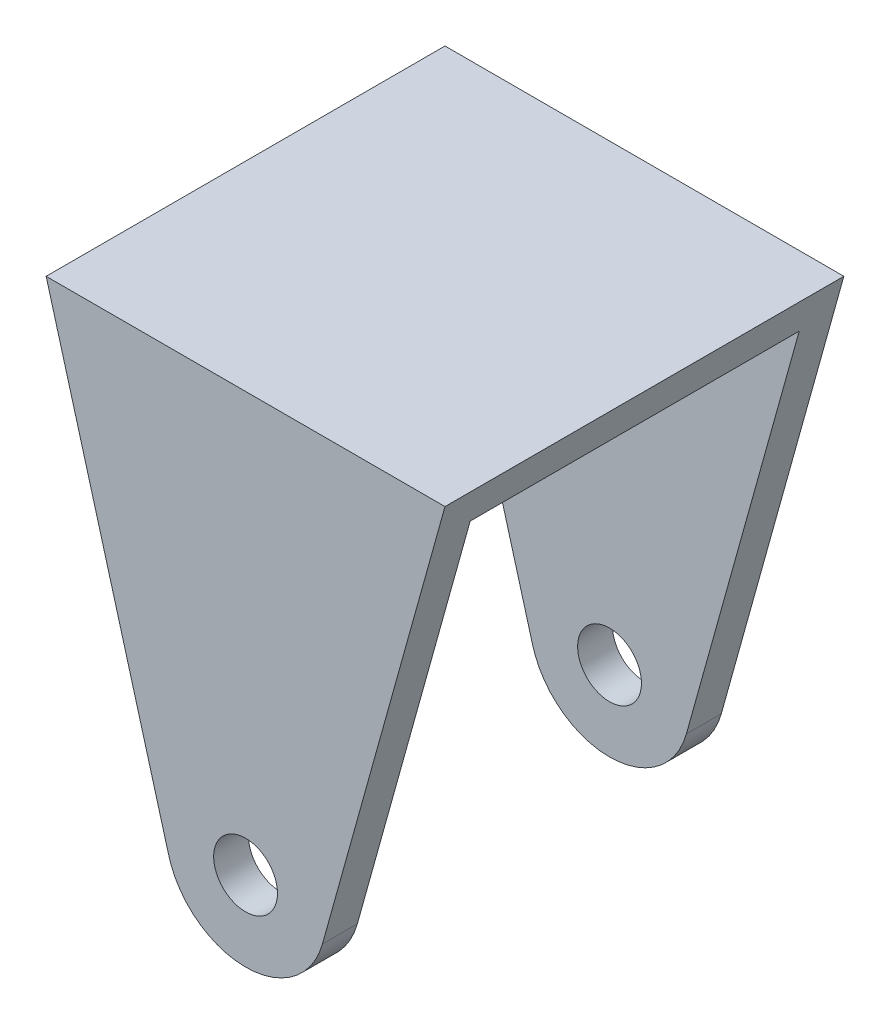
ISO-10303-21;
HEADER;
FILE_DESCRIPTION(('STEP AP214'),'2;1');
FILE_NAME('part.step','',(''),(''),'','','');
FILE_SCHEMA(('AUTOMOTIVE_DESIGN { 1 0 10303 214 1 1 1 1 }'));
ENDSEC;
DATA;
#1=APPLICATION_CONTEXT('core data for automotive mechanical design processes');
#2=APPLICATION_PROTOCOL_DEFINITION('international standard','automotive_design',2000,#1);
#3=PRODUCT_CONTEXT('',#1,'mechanical');
#4=PRODUCT('Part','Part','',(#3));
#5=PRODUCT_RELATED_PRODUCT_CATEGORY('part','',(#4));
#6=PRODUCT_DEFINITION_FORMATION('','',#4);
#7=PRODUCT_DEFINITION_CONTEXT('part definition',#1,'design');
#8=PRODUCT_DEFINITION('design','',#6,#7);
#9=PRODUCT_DEFINITION_SHAPE('','',#8);
#10=(LENGTH_UNIT() NAMED_UNIT(*) SI_UNIT(.MILLI.,.METRE.));
#11=(NAMED_UNIT(*) PLANE_ANGLE_UNIT() SI_UNIT($,.RADIAN.));
#12=(NAMED_UNIT(*) SI_UNIT($,.STERADIAN.) SOLID_ANGLE_UNIT());
#13=UNCERTAINTY_MEASURE_WITH_UNIT(LENGTH_MEASURE(1.E-05),#10,'distance_accuracy_value','');
#14=(GEOMETRIC_REPRESENTATION_CONTEXT(3) GLOBAL_UNCERTAINTY_ASSIGNED_CONTEXT((#13)) GLOBAL_UNIT_ASSIGNED_CONTEXT((#10,
#11,#12)) REPRESENTATION_CONTEXT('',''));
#15=CARTESIAN_POINT('',(0.,0.,0.));
#16=DIRECTION('',(0.,0.,1.));
#17=DIRECTION('',(1.,0.,0.));
#18=AXIS2_PLACEMENT_3D('',#15,#16,#17);
#19=CARTESIAN_POINT('',(0.,0.,35.));
#20=DIRECTION('',(0.,0.,-1.));
#21=DIRECTION('',(-1.,0.,0.));
#22=AXIS2_PLACEMENT_3D('',#19,#20,#21);
#23=CYLINDRICAL_SURFACE('',#22,8.);
#24=DIRECTION('',(0.,0.,-1.));
#25=VECTOR('',#24,1.);
#26=CARTESIAN_POINT('',(7.70677187386858,-2.14608184469933,35.));
#27=LINE('',#26,#25);
#28=CARTESIAN_POINT('',(7.70677187386858,-2.14608184469933,-1.5));
#29=VERTEX_POINT('',#28);
#30=CARTESIAN_POINT('',(7.70677187386858,-2.14608184469933,-5.));
#31=VERTEX_POINT('',#30);
#32=EDGE_CURVE('E187',#29,#31,#27,.T.);
#33=ORIENTED_EDGE('',*,*,#32,.F.);
#34=CARTESIAN_POINT('',(0.,0.,-1.5));
#35=DIRECTION('',(0.,0.,-1.));
#36=DIRECTION('',(-1.,0.,0.));
#37=AXIS2_PLACEMENT_3D('',#34,#35,#36);
#38=CIRCLE('',#37,8.);
#39=CARTESIAN_POINT('',(-7.74121405488212,-2.01831735772539,-1.5));
#40=VERTEX_POINT('',#39);
#41=EDGE_CURVE('E64',#29,#40,#38,.T.);
#42=ORIENTED_EDGE('',*,*,#41,.T.);
#43=DIRECTION('',(0.,0.,-1.));
#44=VECTOR('',#43,1.);
#45=CARTESIAN_POINT('',(-7.74121405488212,-2.01831735772539,35.));
#46=LINE('',#45,#44);
#47=CARTESIAN_POINT('',(-7.74121405488212,-2.01831735772539,-5.));
#48=VERTEX_POINT('',#47);
#49=EDGE_CURVE('E146',#40,#48,#46,.T.);
#50=ORIENTED_EDGE('',*,*,#49,.T.);
#51=CARTESIAN_POINT('',(0.,0.,-5.));
#52=DIRECTION('',(0.,0.,1.));
#53=DIRECTION('',(1.,0.,0.));
#54=AXIS2_PLACEMENT_3D('',#51,#52,#53);
#55=CIRCLE('',#54,8.);
#56=EDGE_CURVE('E172',#48,#31,#55,.T.);
#57=ORIENTED_EDGE('',*,*,#56,.T.);
#58=EDGE_LOOP('',(#33,#42,#50,#57));
#59=FACE_BOUND('',#58,.T.);
#60=ADVANCED_FACE('F47',(#59),#23,.T.);
#61=CARTESIAN_POINT('',(-7.7056631599761,-2.1459719706153,35.));
#62=DIRECTION('',(0.96334005901347,0.268283303058398,0.));
#63=DIRECTION('',(-0.268283303058398,0.96334005901347,0.));
#64=AXIS2_PLACEMENT_3D('',#61,#62,#63);
#65=PLANE('',#64);
#66=DIRECTION('',(0.,0.,1.));
#67=VECTOR('',#66,1.);
#68=CARTESIAN_POINT('',(-19.0252750812979,38.5,35.));
#69=LINE('',#68,#67);
#70=CARTESIAN_POINT('',(-19.0252750812979,38.5,-1.5));
#71=VERTEX_POINT('',#70);
#72=CARTESIAN_POINT('',(-19.0252750812979,38.5,31.5));
#73=VERTEX_POINT('',#72);
#74=EDGE_CURVE('E125',#71,#73,#69,.T.);
#75=ORIENTED_EDGE('',*,*,#74,.T.);
#76=DIRECTION('',(0.268283303058398,-0.96334005901347,0.));
#77=VECTOR('',#76,1.);
#78=CARTESIAN_POINT('',(-7.7056631599761,-2.1459719706153,31.5));
#79=LINE('',#78,#77);
#80=CARTESIAN_POINT('',(-7.74121405488212,-2.01831735772539,31.5));
#81=VERTEX_POINT('',#80);
#82=EDGE_CURVE('E154',#73,#81,#79,.T.);
#83=ORIENTED_EDGE('',*,*,#82,.T.);
#84=CARTESIAN_POINT('',(-7.74121405488212,-2.01831735772539,35.));
#85=VERTEX_POINT('',#84);
#86=EDGE_CURVE('E192',#85,#81,#46,.T.);
#87=ORIENTED_EDGE('',*,*,#86,.F.);
#88=DIRECTION('',(0.268283303058398,-0.96334005901347,0.));
#89=VECTOR('',#88,1.);
#90=CARTESIAN_POINT('',(-7.7056631599761,-2.1459719706153,35.));
#91=LINE('',#90,#89);
#92=CARTESIAN_POINT('',(-20.,42.,35.));
#93=VERTEX_POINT('',#92);
#94=EDGE_CURVE('E158',#93,#85,#91,.T.);
#95=ORIENTED_EDGE('',*,*,#94,.F.);
#96=DIRECTION('',(0.,0.,-1.));
#97=VECTOR('',#96,1.);
#98=CARTESIAN_POINT('',(-20.,42.,35.));
#99=LINE('',#98,#97);
#100=CARTESIAN_POINT('',(-20.,42.,-5.));
#101=VERTEX_POINT('',#100);
#102=EDGE_CURVE('E169',#93,#101,#99,.T.);
#103=ORIENTED_EDGE('',*,*,#102,.T.);
#104=DIRECTION('',(0.268283303058398,-0.96334005901347,0.));
#105=VECTOR('',#104,1.);
#106=CARTESIAN_POINT('',(-7.7056631599761,-2.1459719706153,-5.));
#107=LINE('',#106,#105);
#108=EDGE_CURVE('E157',#101,#48,#107,.T.);
#109=ORIENTED_EDGE('',*,*,#108,.T.);
#110=ORIENTED_EDGE('',*,*,#49,.F.);
#111=DIRECTION('',(-0.268283303058398,0.96334005901347,0.));
#112=VECTOR('',#111,1.);
#113=CARTESIAN_POINT('',(-7.7056631599761,-2.1459719706153,-1.5));
#114=LINE('',#113,#112);
#115=EDGE_CURVE('E137',#40,#71,#114,.T.);
#116=ORIENTED_EDGE('',*,*,#115,.T.);
#117=EDGE_LOOP('',(#75,#83,#87,#95,#103,#109,#110,#116));
#118=FACE_BOUND('',#117,.T.);
#119=ADVANCED_FACE('F49',(#118),#65,.F.);
#120=CARTESIAN_POINT('',(0.,0.,31.5));
#121=DIRECTION('',(0.,0.,1.));
#122=DIRECTION('',(1.,0.,0.));
#123=AXIS2_PLACEMENT_3D('',#120,#121,#122);
#124=CIRCLE('',#123,8.);
#125=CARTESIAN_POINT('',(7.70677187386858,-2.14608184469933,31.5));
#126=VERTEX_POINT('',#125);
#127=EDGE_CURVE('E136',#81,#126,#124,.T.);
#128=ORIENTED_EDGE('',*,*,#127,.T.);
#129=CARTESIAN_POINT('',(7.70677187386858,-2.14608184469933,35.));
#130=VERTEX_POINT('',#129);
#131=EDGE_CURVE('E188',#130,#126,#27,.T.);
#132=ORIENTED_EDGE('',*,*,#131,.F.);
#133=CARTESIAN_POINT('',(0.,0.,35.));
#134=DIRECTION('',(0.,0.,1.));
#135=DIRECTION('',(1.,0.,0.));
#136=AXIS2_PLACEMENT_3D('',#133,#134,#135);
#137=CIRCLE('',#136,8.);
#138=EDGE_CURVE('E102',#85,#130,#137,.T.);
#139=ORIENTED_EDGE('',*,*,#138,.F.);
#140=ORIENTED_EDGE('',*,*,#86,.T.);
#141=EDGE_LOOP('',(#128,#132,#139,#140));
#142=FACE_BOUND('',#141,.T.);
#143=ADVANCED_FACE('F205',(#142),#23,.T.);
#144=CARTESIAN_POINT('',(7.70677187386858,-2.14608184469933,35.));
#145=DIRECTION('',(0.963346484233573,-0.268260230587416,0.));
#146=DIRECTION('',(0.268260230587416,0.963346484233573,0.));
#147=AXIS2_PLACEMENT_3D('',#144,#145,#146);
#148=PLANE('',#147);
#149=DIRECTION('',(-0.268260230587416,-0.963346484233573,0.));
#150=VECTOR('',#149,1.);
#151=CARTESIAN_POINT('',(7.70677187386858,-2.14608184469933,31.5));
#152=LINE('',#151,#150);
#153=CARTESIAN_POINT('',(19.025365408581,38.5,31.5));
#154=VERTEX_POINT('',#153);
#155=EDGE_CURVE('E11',#154,#126,#152,.T.);
#156=ORIENTED_EDGE('',*,*,#155,.F.);
#157=DIRECTION('',(0.,0.,1.));
#158=VECTOR('',#157,1.);
#159=CARTESIAN_POINT('',(19.025365408581,38.5,35.));
#160=LINE('',#159,#158);
#161=CARTESIAN_POINT('',(19.025365408581,38.5,-1.5));
#162=VERTEX_POINT('',#161);
#163=EDGE_CURVE('E57',#162,#154,#160,.T.);
#164=ORIENTED_EDGE('',*,*,#163,.F.);
#165=DIRECTION('',(0.268260230587416,0.963346484233573,0.));
#166=VECTOR('',#165,1.);
#167=CARTESIAN_POINT('',(7.70677187386858,-2.14608184469933,-1.5));
#168=LINE('',#167,#166);
#169=EDGE_CURVE('E140',#29,#162,#168,.T.);
#170=ORIENTED_EDGE('',*,*,#169,.F.);
#171=ORIENTED_EDGE('',*,*,#32,.T.);
#172=DIRECTION('',(-0.268260230587416,-0.963346484233573,0.));
#173=VECTOR('',#172,1.);
#174=CARTESIAN_POINT('',(7.70677187386858,-2.14608184469933,-5.));
#175=LINE('',#174,#173);
#176=CARTESIAN_POINT('',(20.,42.,-5.));
#177=VERTEX_POINT('',#176);
#178=EDGE_CURVE('E176',#177,#31,#175,.T.);
#179=ORIENTED_EDGE('',*,*,#178,.F.);
#180=DIRECTION('',(0.,0.,-1.));
#181=VECTOR('',#180,1.);
#182=CARTESIAN_POINT('',(20.,42.,35.));
#183=LINE('',#182,#181);
#184=CARTESIAN_POINT('',(20.,42.,35.));
#185=VERTEX_POINT('',#184);
#186=EDGE_CURVE('E184',#185,#177,#183,.T.);
#187=ORIENTED_EDGE('',*,*,#186,.F.);
#188=DIRECTION('',(-0.268260230587416,-0.963346484233573,0.));
#189=VECTOR('',#188,1.);
#190=CARTESIAN_POINT('',(7.70677187386858,-2.14608184469933,35.));
#191=LINE('',#190,#189);
#192=EDGE_CURVE('E163',#185,#130,#191,.T.);
#193=ORIENTED_EDGE('',*,*,#192,.T.);
#194=ORIENTED_EDGE('',*,*,#131,.T.);
#195=EDGE_LOOP('',(#156,#164,#170,#171,#179,#187,#193,#194));
#196=FACE_BOUND('',#195,.T.);
#197=ADVANCED_FACE('F204',(#196),#148,.T.);
#198=CARTESIAN_POINT('',(0.,42.,35.));
#199=DIRECTION('',(0.,-1.,0.));
#200=DIRECTION('',(0.,0.,-1.));
#201=AXIS2_PLACEMENT_3D('',#198,#199,#200);
#202=PLANE('',#201);
#203=DIRECTION('',(-1.,0.,0.));
#204=VECTOR('',#203,1.);
#205=CARTESIAN_POINT('',(0.,42.,-5.));
#206=LINE('',#205,#204);
#207=EDGE_CURVE('E94',#177,#101,#206,.T.);
#208=ORIENTED_EDGE('',*,*,#207,.T.);
#209=ORIENTED_EDGE('',*,*,#102,.F.);
#210=DIRECTION('',(-1.,0.,0.));
#211=VECTOR('',#210,1.);
#212=CARTESIAN_POINT('',(0.,42.,35.));
#213=LINE('',#212,#211);
#214=EDGE_CURVE('E73',#185,#93,#213,.T.);
#215=ORIENTED_EDGE('',*,*,#214,.F.);
#216=ORIENTED_EDGE('',*,*,#186,.T.);
#217=EDGE_LOOP('',(#208,#209,#215,#216));
#218=FACE_BOUND('',#217,.T.);
#219=ADVANCED_FACE('F212',(#218),#202,.F.);
#220=CARTESIAN_POINT('',(0.,0.,35.));
#221=DIRECTION('',(0.,0.,1.));
#222=DIRECTION('',(1.,0.,0.));
#223=AXIS2_PLACEMENT_3D('',#220,#221,#222);
#224=PLANE('',#223);
#225=CARTESIAN_POINT('',(0.,0.,35.));
#226=DIRECTION('',(0.,0.,1.));
#227=DIRECTION('',(1.,0.,0.));
#228=AXIS2_PLACEMENT_3D('',#225,#226,#227);
#229=CIRCLE('',#228,3.2);
#230=CARTESIAN_POINT('',(3.2,0.,35.));
#231=VERTEX_POINT('',#230);
#232=EDGE_CURVE('E142',#231,#231,#229,.T.);
#233=ORIENTED_EDGE('',*,*,#232,.F.);
#234=EDGE_LOOP('',(#233));
#235=FACE_BOUND('',#234,.T.);
#236=ORIENTED_EDGE('',*,*,#94,.T.);
#237=ORIENTED_EDGE('',*,*,#138,.T.);
#238=ORIENTED_EDGE('',*,*,#192,.F.);
#239=ORIENTED_EDGE('',*,*,#214,.T.);
#240=EDGE_LOOP('',(#236,#237,#238,#239));
#241=FACE_BOUND('',#240,.T.);
#242=ADVANCED_FACE('F209',(#235,#241),#224,.T.);
#243=CARTESIAN_POINT('',(0.,0.,-5.));
#244=DIRECTION('',(0.,0.,1.));
#245=DIRECTION('',(1.,0.,0.));
#246=AXIS2_PLACEMENT_3D('',#243,#244,#245);
#247=PLANE('',#246);
#248=CARTESIAN_POINT('',(0.,0.,-5.));
#249=DIRECTION('',(0.,0.,1.));
#250=DIRECTION('',(1.,0.,0.));
#251=AXIS2_PLACEMENT_3D('',#248,#249,#250);
#252=CIRCLE('',#251,3.2);
#253=CARTESIAN_POINT('',(3.2,0.,-5.));
#254=VERTEX_POINT('',#253);
#255=EDGE_CURVE('E296',#254,#254,#252,.T.);
#256=ORIENTED_EDGE('',*,*,#255,.T.);
#257=EDGE_LOOP('',(#256));
#258=FACE_BOUND('',#257,.T.);
#259=ORIENTED_EDGE('',*,*,#108,.F.);
#260=ORIENTED_EDGE('',*,*,#207,.F.);
#261=ORIENTED_EDGE('',*,*,#178,.T.);
#262=ORIENTED_EDGE('',*,*,#56,.F.);
#263=EDGE_LOOP('',(#259,#260,#261,#262));
#264=FACE_BOUND('',#263,.T.);
#265=ADVANCED_FACE('F211',(#258,#264),#247,.F.);
#266=CARTESIAN_POINT('',(-20.,-8.,31.5));
#267=DIRECTION('',(0.,0.,1.));
#268=DIRECTION('',(1.,0.,0.));
#269=AXIS2_PLACEMENT_3D('',#266,#267,#268);
#270=PLANE('',#269);
#271=CARTESIAN_POINT('',(0.,0.,31.5));
#272=DIRECTION('',(0.,0.,1.));
#273=DIRECTION('',(1.,0.,0.));
#274=AXIS2_PLACEMENT_3D('',#271,#272,#273);
#275=CIRCLE('',#274,3.2);
#276=CARTESIAN_POINT('',(3.2,0.,31.5));
#277=VERTEX_POINT('',#276);
#278=EDGE_CURVE('E289',#277,#277,#275,.T.);
#279=ORIENTED_EDGE('',*,*,#278,.T.);
#280=EDGE_LOOP('',(#279));
#281=FACE_BOUND('',#280,.T.);
#282=DIRECTION('',(1.,0.,0.));
#283=VECTOR('',#282,1.);
#284=CARTESIAN_POINT('',(-20.,38.5,31.5));
#285=LINE('',#284,#283);
#286=EDGE_CURVE('E131',#73,#154,#285,.T.);
#287=ORIENTED_EDGE('',*,*,#286,.T.);
#288=ORIENTED_EDGE('',*,*,#155,.T.);
#289=ORIENTED_EDGE('',*,*,#127,.F.);
#290=ORIENTED_EDGE('',*,*,#82,.F.);
#291=EDGE_LOOP('',(#287,#288,#289,#290));
#292=FACE_BOUND('',#291,.T.);
#293=ADVANCED_FACE('F201',(#281,#292),#270,.F.);
#294=CARTESIAN_POINT('',(-20.,38.5,31.5));
#295=DIRECTION('',(0.,1.,0.));
#296=DIRECTION('',(0.,0.,1.));
#297=AXIS2_PLACEMENT_3D('',#294,#295,#296);
#298=PLANE('',#297);
#299=DIRECTION('',(1.,0.,0.));
#300=VECTOR('',#299,1.);
#301=CARTESIAN_POINT('',(-20.,38.5,-1.5));
#302=LINE('',#301,#300);
#303=EDGE_CURVE('E128',#71,#162,#302,.T.);
#304=ORIENTED_EDGE('',*,*,#303,.T.);
#305=ORIENTED_EDGE('',*,*,#163,.T.);
#306=ORIENTED_EDGE('',*,*,#286,.F.);
#307=ORIENTED_EDGE('',*,*,#74,.F.);
#308=EDGE_LOOP('',(#304,#305,#306,#307));
#309=FACE_BOUND('',#308,.T.);
#310=ADVANCED_FACE('F127',(#309),#298,.F.);
#311=CARTESIAN_POINT('',(-20.,-8.,-1.5));
#312=DIRECTION('',(0.,0.,-1.));
#313=DIRECTION('',(-1.,0.,0.));
#314=AXIS2_PLACEMENT_3D('',#311,#312,#313);
#315=PLANE('',#314);
#316=CARTESIAN_POINT('',(0.,0.,-1.5));
#317=DIRECTION('',(0.,0.,-1.));
#318=DIRECTION('',(-1.,0.,0.));
#319=AXIS2_PLACEMENT_3D('',#316,#317,#318);
#320=CIRCLE('',#319,3.2);
#321=CARTESIAN_POINT('',(-3.2,0.,-1.5));
#322=VERTEX_POINT('',#321);
#323=EDGE_CURVE('E51',#322,#322,#320,.T.);
#324=ORIENTED_EDGE('',*,*,#323,.T.);
#325=EDGE_LOOP('',(#324));
#326=FACE_BOUND('',#325,.T.);
#327=ORIENTED_EDGE('',*,*,#41,.F.);
#328=ORIENTED_EDGE('',*,*,#169,.T.);
#329=ORIENTED_EDGE('',*,*,#303,.F.);
#330=ORIENTED_EDGE('',*,*,#115,.F.);
#331=EDGE_LOOP('',(#327,#328,#329,#330));
#332=FACE_BOUND('',#331,.T.);
#333=ADVANCED_FACE('F139',(#326,#332),#315,.F.);
#334=CARTESIAN_POINT('',(0.,0.,-5.));
#335=DIRECTION('',(0.,0.,1.));
#336=DIRECTION('',(1.,0.,0.));
#337=AXIS2_PLACEMENT_3D('',#334,#335,#336);
#338=CYLINDRICAL_SURFACE('',#337,3.2);
#339=ORIENTED_EDGE('',*,*,#255,.F.);
#340=EDGE_LOOP('',(#339));
#341=FACE_BOUND('',#340,.T.);
#342=ORIENTED_EDGE('',*,*,#323,.F.);
#343=EDGE_LOOP('',(#342));
#344=FACE_BOUND('',#343,.T.);
#345=ADVANCED_FACE('F261',(#341,#344),#338,.F.);
#346=ORIENTED_EDGE('',*,*,#232,.T.);
#347=EDGE_LOOP('',(#346));
#348=FACE_BOUND('',#347,.T.);
#349=ORIENTED_EDGE('',*,*,#278,.F.);
#350=EDGE_LOOP('',(#349));
#351=FACE_BOUND('',#350,.T.);
#352=ADVANCED_FACE('F271',(#348,#351),#338,.F.);
#353=CLOSED_SHELL('',(#60,#119,#143,#197,#219,#242,#265,#293,#310,#333,#345,#352));
#354=MANIFOLD_SOLID_BREP('B2',#353);
#355=ADVANCED_BREP_SHAPE_REPRESENTATION('',(#18,#354),#14);
#356=SHAPE_DEFINITION_REPRESENTATION(#9,#355);
ENDSEC;
END-ISO-10303-21;
